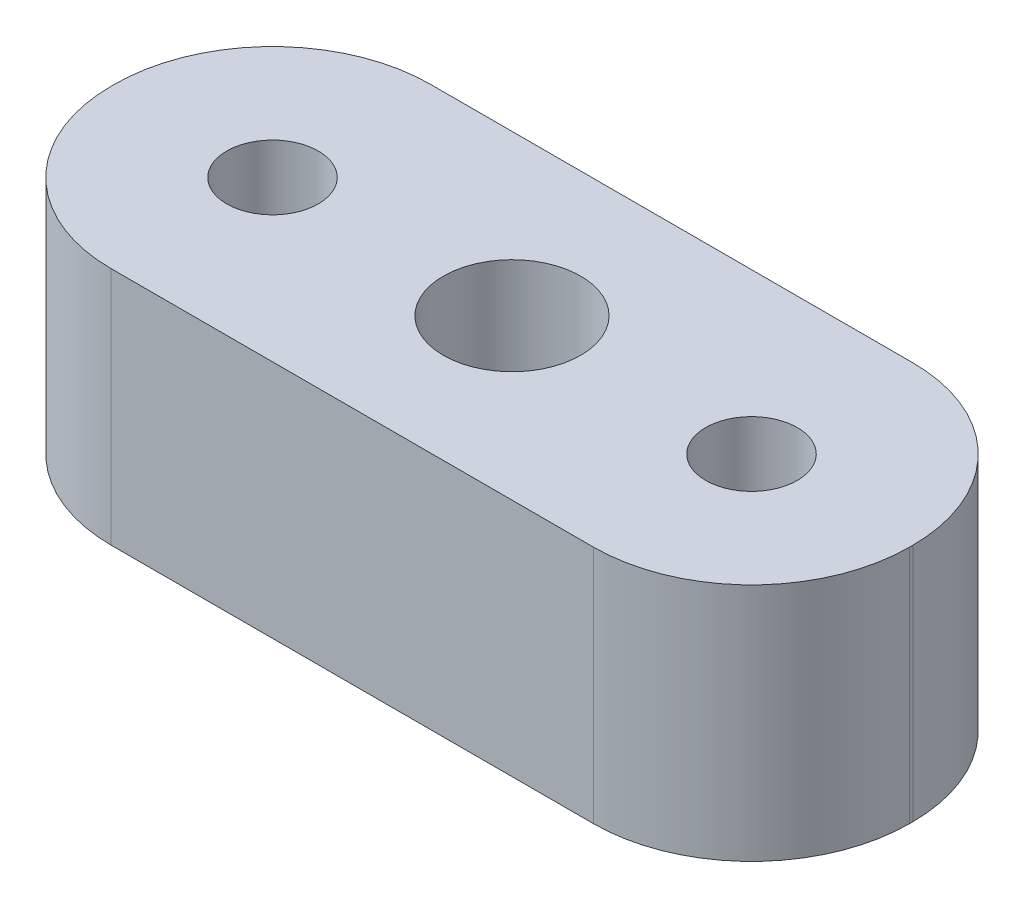
ISO-10303-21;
HEADER;
FILE_DESCRIPTION(('STEP AP214'),'2;1');
FILE_NAME('part.step','',(''),(''),'','','');
FILE_SCHEMA(('AUTOMOTIVE_DESIGN { 1 0 10303 214 1 1 1 1 }'));
ENDSEC;
DATA;
#1=APPLICATION_CONTEXT('core data for automotive mechanical design processes');
#2=APPLICATION_PROTOCOL_DEFINITION('international standard','automotive_design',2000,#1);
#3=PRODUCT_CONTEXT('',#1,'mechanical');
#4=PRODUCT('Part','Part','',(#3));
#5=PRODUCT_RELATED_PRODUCT_CATEGORY('part','',(#4));
#6=PRODUCT_DEFINITION_FORMATION('','',#4);
#7=PRODUCT_DEFINITION_CONTEXT('part definition',#1,'design');
#8=PRODUCT_DEFINITION('design','',#6,#7);
#9=PRODUCT_DEFINITION_SHAPE('','',#8);
#10=(LENGTH_UNIT() NAMED_UNIT(*) SI_UNIT(.MILLI.,.METRE.));
#11=(NAMED_UNIT(*) PLANE_ANGLE_UNIT() SI_UNIT($,.RADIAN.));
#12=(NAMED_UNIT(*) SI_UNIT($,.STERADIAN.) SOLID_ANGLE_UNIT());
#13=UNCERTAINTY_MEASURE_WITH_UNIT(LENGTH_MEASURE(1.E-05),#10,'distance_accuracy_value','');
#14=(GEOMETRIC_REPRESENTATION_CONTEXT(3) GLOBAL_UNCERTAINTY_ASSIGNED_CONTEXT((#13)) GLOBAL_UNIT_ASSIGNED_CONTEXT((#10,
#11,#12)) REPRESENTATION_CONTEXT('',''));
#15=CARTESIAN_POINT('',(0.,0.,0.));
#16=DIRECTION('',(0.,0.,1.));
#17=DIRECTION('',(1.,0.,0.));
#18=AXIS2_PLACEMENT_3D('',#15,#16,#17);
#19=CARTESIAN_POINT('',(-1.51,1.5,-0.00999999999999959));
#20=DIRECTION('',(0.,-1.,0.));
#21=DIRECTION('',(0.,0.,-1.));
#22=AXIS2_PLACEMENT_3D('',#19,#20,#21);
#23=CYLINDRICAL_SURFACE('',#22,0.99);
#24=CARTESIAN_POINT('',(-1.51,0.,-0.00999999999999959));
#25=DIRECTION('',(0.,1.,0.));
#26=DIRECTION('',(0.,0.,1.));
#27=AXIS2_PLACEMENT_3D('',#24,#25,#26);
#28=CIRCLE('',#27,0.99);
#29=CARTESIAN_POINT('',(-2.5,0.,-0.00999999999999947));
#30=VERTEX_POINT('',#29);
#31=CARTESIAN_POINT('',(-1.51,0.,-1.));
#32=VERTEX_POINT('',#31);
#33=EDGE_CURVE('E140',#30,#32,#28,.F.);
#34=ORIENTED_EDGE('',*,*,#33,.F.);
#35=DIRECTION('',(0.,-1.,0.));
#36=VECTOR('',#35,1.);
#37=CARTESIAN_POINT('',(-2.5,1.5,-0.00999999999999947));
#38=LINE('',#37,#36);
#39=CARTESIAN_POINT('',(-2.5,1.5,-0.00999999999999947));
#40=VERTEX_POINT('',#39);
#41=EDGE_CURVE('E11',#40,#30,#38,.T.);
#42=ORIENTED_EDGE('',*,*,#41,.F.);
#43=CARTESIAN_POINT('',(-1.51,1.5,-0.00999999999999959));
#44=DIRECTION('',(0.,1.,0.));
#45=DIRECTION('',(0.,0.,1.));
#46=AXIS2_PLACEMENT_3D('',#43,#44,#45);
#47=CIRCLE('',#46,0.99);
#48=CARTESIAN_POINT('',(-1.51,1.5,-1.));
#49=VERTEX_POINT('',#48);
#50=EDGE_CURVE('E168',#40,#49,#47,.F.);
#51=ORIENTED_EDGE('',*,*,#50,.T.);
#52=DIRECTION('',(0.,-1.,0.));
#53=VECTOR('',#52,1.);
#54=CARTESIAN_POINT('',(-1.51,1.5,-1.));
#55=LINE('',#54,#53);
#56=EDGE_CURVE('E51',#49,#32,#55,.T.);
#57=ORIENTED_EDGE('',*,*,#56,.T.);
#58=EDGE_LOOP('',(#34,#42,#51,#57));
#59=FACE_BOUND('',#58,.T.);
#60=ADVANCED_FACE('F35',(#59),#23,.T.);
#61=CARTESIAN_POINT('',(-2.5,1.5,0.));
#62=DIRECTION('',(1.,0.,0.));
#63=DIRECTION('',(0.,0.,-1.));
#64=AXIS2_PLACEMENT_3D('',#61,#62,#63);
#65=PLANE('',#64);
#66=DIRECTION('',(0.,0.,1.));
#67=VECTOR('',#66,1.);
#68=CARTESIAN_POINT('',(-2.5,0.,0.));
#69=LINE('',#68,#67);
#70=CARTESIAN_POINT('',(-2.5,0.,0.0100000000000003));
#71=VERTEX_POINT('',#70);
#72=EDGE_CURVE('E142',#30,#71,#69,.T.);
#73=ORIENTED_EDGE('',*,*,#72,.T.);
#74=DIRECTION('',(0.,-1.,0.));
#75=VECTOR('',#74,1.);
#76=CARTESIAN_POINT('',(-2.5,1.5,0.0100000000000003));
#77=LINE('',#76,#75);
#78=CARTESIAN_POINT('',(-2.5,1.5,0.0100000000000003));
#79=VERTEX_POINT('',#78);
#80=EDGE_CURVE('E43',#79,#71,#77,.T.);
#81=ORIENTED_EDGE('',*,*,#80,.F.);
#82=DIRECTION('',(0.,0.,1.));
#83=VECTOR('',#82,1.);
#84=CARTESIAN_POINT('',(-2.5,1.5,0.));
#85=LINE('',#84,#83);
#86=EDGE_CURVE('E319',#40,#79,#85,.T.);
#87=ORIENTED_EDGE('',*,*,#86,.F.);
#88=ORIENTED_EDGE('',*,*,#41,.T.);
#89=EDGE_LOOP('',(#73,#81,#87,#88));
#90=FACE_BOUND('',#89,.T.);
#91=ADVANCED_FACE('F185',(#90),#65,.F.);
#92=CARTESIAN_POINT('',(-1.51,1.5,0.0100000000000002));
#93=DIRECTION('',(0.,-1.,0.));
#94=DIRECTION('',(0.,0.,-1.));
#95=AXIS2_PLACEMENT_3D('',#92,#93,#94);
#96=CYLINDRICAL_SURFACE('',#95,0.99);
#97=CARTESIAN_POINT('',(-1.51,0.,0.0100000000000002));
#98=DIRECTION('',(0.,1.,0.));
#99=DIRECTION('',(0.,0.,1.));
#100=AXIS2_PLACEMENT_3D('',#97,#98,#99);
#101=CIRCLE('',#100,0.99);
#102=CARTESIAN_POINT('',(-1.51,0.,1.));
#103=VERTEX_POINT('',#102);
#104=EDGE_CURVE('E145',#103,#71,#101,.F.);
#105=ORIENTED_EDGE('',*,*,#104,.F.);
#106=DIRECTION('',(0.,-1.,0.));
#107=VECTOR('',#106,1.);
#108=CARTESIAN_POINT('',(-1.51,1.5,1.));
#109=LINE('',#108,#107);
#110=CARTESIAN_POINT('',(-1.51,1.5,1.));
#111=VERTEX_POINT('',#110);
#112=EDGE_CURVE('E175',#111,#103,#109,.T.);
#113=ORIENTED_EDGE('',*,*,#112,.F.);
#114=CARTESIAN_POINT('',(-1.51,1.5,0.0100000000000002));
#115=DIRECTION('',(0.,1.,0.));
#116=DIRECTION('',(0.,0.,1.));
#117=AXIS2_PLACEMENT_3D('',#114,#115,#116);
#118=CIRCLE('',#117,0.99);
#119=EDGE_CURVE('E182',#111,#79,#118,.F.);
#120=ORIENTED_EDGE('',*,*,#119,.T.);
#121=ORIENTED_EDGE('',*,*,#80,.T.);
#122=EDGE_LOOP('',(#105,#113,#120,#121));
#123=FACE_BOUND('',#122,.T.);
#124=ADVANCED_FACE('F180',(#123),#96,.T.);
#125=CARTESIAN_POINT('',(0.,1.5,1.));
#126=DIRECTION('',(0.,0.,-1.));
#127=DIRECTION('',(-1.,0.,0.));
#128=AXIS2_PLACEMENT_3D('',#125,#126,#127);
#129=PLANE('',#128);
#130=DIRECTION('',(1.,0.,0.));
#131=VECTOR('',#130,1.);
#132=CARTESIAN_POINT('',(0.,0.,1.));
#133=LINE('',#132,#131);
#134=CARTESIAN_POINT('',(1.50999999999999,0.,1.));
#135=VERTEX_POINT('',#134);
#136=EDGE_CURVE('E148',#103,#135,#133,.T.);
#137=ORIENTED_EDGE('',*,*,#136,.T.);
#138=DIRECTION('',(0.,-1.,0.));
#139=VECTOR('',#138,1.);
#140=CARTESIAN_POINT('',(1.50999999999999,1.5,1.));
#141=LINE('',#140,#139);
#142=CARTESIAN_POINT('',(1.50999999999999,1.5,1.));
#143=VERTEX_POINT('',#142);
#144=EDGE_CURVE('E172',#143,#135,#141,.T.);
#145=ORIENTED_EDGE('',*,*,#144,.F.);
#146=DIRECTION('',(1.,0.,0.));
#147=VECTOR('',#146,1.);
#148=CARTESIAN_POINT('',(0.,1.5,1.));
#149=LINE('',#148,#147);
#150=EDGE_CURVE('E126',#111,#143,#149,.T.);
#151=ORIENTED_EDGE('',*,*,#150,.F.);
#152=ORIENTED_EDGE('',*,*,#112,.T.);
#153=EDGE_LOOP('',(#137,#145,#151,#152));
#154=FACE_BOUND('',#153,.T.);
#155=ADVANCED_FACE('F193',(#154),#129,.F.);
#156=CARTESIAN_POINT('',(1.51,1.5,0.00999999999999981));
#157=DIRECTION('',(0.,-1.,0.));
#158=DIRECTION('',(0.,0.,-1.));
#159=AXIS2_PLACEMENT_3D('',#156,#157,#158);
#160=CYLINDRICAL_SURFACE('',#159,0.99);
#161=CARTESIAN_POINT('',(1.51,0.,0.00999999999999981));
#162=DIRECTION('',(0.,1.,0.));
#163=DIRECTION('',(0.,0.,1.));
#164=AXIS2_PLACEMENT_3D('',#161,#162,#163);
#165=CIRCLE('',#164,0.99);
#166=CARTESIAN_POINT('',(2.5,0.,0.00999999999999309));
#167=VERTEX_POINT('',#166);
#168=EDGE_CURVE('E150',#135,#167,#165,.T.);
#169=ORIENTED_EDGE('',*,*,#168,.T.);
#170=DIRECTION('',(0.,-1.,0.));
#171=VECTOR('',#170,1.);
#172=CARTESIAN_POINT('',(2.5,1.5,0.00999999999999309));
#173=LINE('',#172,#171);
#174=CARTESIAN_POINT('',(2.5,1.5,0.00999999999999309));
#175=VERTEX_POINT('',#174);
#176=EDGE_CURVE('E111',#175,#167,#173,.T.);
#177=ORIENTED_EDGE('',*,*,#176,.F.);
#178=CARTESIAN_POINT('',(1.51,1.5,0.00999999999999981));
#179=DIRECTION('',(0.,1.,0.));
#180=DIRECTION('',(0.,0.,1.));
#181=AXIS2_PLACEMENT_3D('',#178,#179,#180);
#182=CIRCLE('',#181,0.99);
#183=EDGE_CURVE('E123',#143,#175,#182,.T.);
#184=ORIENTED_EDGE('',*,*,#183,.F.);
#185=ORIENTED_EDGE('',*,*,#144,.T.);
#186=EDGE_LOOP('',(#169,#177,#184,#185));
#187=FACE_BOUND('',#186,.T.);
#188=ADVANCED_FACE('F196',(#187),#160,.T.);
#189=CARTESIAN_POINT('',(2.5,1.5,0.));
#190=DIRECTION('',(1.,0.,0.));
#191=DIRECTION('',(0.,0.,-1.));
#192=AXIS2_PLACEMENT_3D('',#189,#190,#191);
#193=PLANE('',#192);
#194=DIRECTION('',(0.,0.,1.));
#195=VECTOR('',#194,1.);
#196=CARTESIAN_POINT('',(2.5,0.,0.));
#197=LINE('',#196,#195);
#198=CARTESIAN_POINT('',(2.5,0.,-0.00999999999999309));
#199=VERTEX_POINT('',#198);
#200=EDGE_CURVE('E108',#199,#167,#197,.T.);
#201=ORIENTED_EDGE('',*,*,#200,.F.);
#202=DIRECTION('',(0.,-1.,0.));
#203=VECTOR('',#202,1.);
#204=CARTESIAN_POINT('',(2.5,1.5,-0.00999999999999309));
#205=LINE('',#204,#203);
#206=CARTESIAN_POINT('',(2.5,1.5,-0.00999999999999309));
#207=VERTEX_POINT('',#206);
#208=EDGE_CURVE('E102',#207,#199,#205,.T.);
#209=ORIENTED_EDGE('',*,*,#208,.F.);
#210=DIRECTION('',(0.,0.,1.));
#211=VECTOR('',#210,1.);
#212=CARTESIAN_POINT('',(2.5,1.5,0.));
#213=LINE('',#212,#211);
#214=EDGE_CURVE('E106',#207,#175,#213,.T.);
#215=ORIENTED_EDGE('',*,*,#214,.T.);
#216=ORIENTED_EDGE('',*,*,#176,.T.);
#217=EDGE_LOOP('',(#201,#209,#215,#216));
#218=FACE_BOUND('',#217,.T.);
#219=ADVANCED_FACE('F104',(#218),#193,.T.);
#220=CARTESIAN_POINT('',(1.51,1.5,-0.0100000000000002));
#221=DIRECTION('',(0.,-1.,0.));
#222=DIRECTION('',(0.,0.,-1.));
#223=AXIS2_PLACEMENT_3D('',#220,#221,#222);
#224=CYLINDRICAL_SURFACE('',#223,0.99);
#225=CARTESIAN_POINT('',(1.51,0.,-0.0100000000000002));
#226=DIRECTION('',(0.,1.,0.));
#227=DIRECTION('',(0.,0.,1.));
#228=AXIS2_PLACEMENT_3D('',#225,#226,#227);
#229=CIRCLE('',#228,0.99);
#230=CARTESIAN_POINT('',(1.50999999999999,0.,-1.));
#231=VERTEX_POINT('',#230);
#232=EDGE_CURVE('E154',#199,#231,#229,.T.);
#233=ORIENTED_EDGE('',*,*,#232,.T.);
#234=DIRECTION('',(0.,-1.,0.));
#235=VECTOR('',#234,1.);
#236=CARTESIAN_POINT('',(1.50999999999999,1.5,-1.));
#237=LINE('',#236,#235);
#238=CARTESIAN_POINT('',(1.50999999999999,1.5,-1.));
#239=VERTEX_POINT('',#238);
#240=EDGE_CURVE('E77',#239,#231,#237,.T.);
#241=ORIENTED_EDGE('',*,*,#240,.F.);
#242=CARTESIAN_POINT('',(1.51,1.5,-0.0100000000000002));
#243=DIRECTION('',(0.,1.,0.));
#244=DIRECTION('',(0.,0.,1.));
#245=AXIS2_PLACEMENT_3D('',#242,#243,#244);
#246=CIRCLE('',#245,0.99);
#247=EDGE_CURVE('E113',#207,#239,#246,.T.);
#248=ORIENTED_EDGE('',*,*,#247,.F.);
#249=ORIENTED_EDGE('',*,*,#208,.T.);
#250=EDGE_LOOP('',(#233,#241,#248,#249));
#251=FACE_BOUND('',#250,.T.);
#252=ADVANCED_FACE('F114',(#251),#224,.T.);
#253=CARTESIAN_POINT('',(1.5,1.5,0.));
#254=DIRECTION('',(0.,-1.,0.));
#255=DIRECTION('',(0.,0.,-1.));
#256=AXIS2_PLACEMENT_3D('',#253,#254,#255);
#257=CYLINDRICAL_SURFACE('',#256,0.287);
#258=CARTESIAN_POINT('',(1.5,1.5,0.));
#259=DIRECTION('',(0.,1.,0.));
#260=DIRECTION('',(0.,0.,1.));
#261=AXIS2_PLACEMENT_3D('',#258,#259,#260);
#262=CIRCLE('',#261,0.287);
#263=CARTESIAN_POINT('',(1.5,1.5,0.287));
#264=VERTEX_POINT('',#263);
#265=EDGE_CURVE('E134',#264,#264,#262,.T.);
#266=ORIENTED_EDGE('',*,*,#265,.T.);
#267=EDGE_LOOP('',(#266));
#268=FACE_BOUND('',#267,.T.);
#269=CARTESIAN_POINT('',(1.5,0.,0.));
#270=DIRECTION('',(0.,1.,0.));
#271=DIRECTION('',(0.,0.,1.));
#272=AXIS2_PLACEMENT_3D('',#269,#270,#271);
#273=CIRCLE('',#272,0.287);
#274=CARTESIAN_POINT('',(1.5,0.,0.287));
#275=VERTEX_POINT('',#274);
#276=EDGE_CURVE('E162',#275,#275,#273,.T.);
#277=ORIENTED_EDGE('',*,*,#276,.F.);
#278=EDGE_LOOP('',(#277));
#279=FACE_BOUND('',#278,.T.);
#280=ADVANCED_FACE('F208',(#268,#279),#257,.F.);
#281=CARTESIAN_POINT('',(-1.5,1.5,0.));
#282=DIRECTION('',(0.,-1.,0.));
#283=DIRECTION('',(0.,0.,-1.));
#284=AXIS2_PLACEMENT_3D('',#281,#282,#283);
#285=CYLINDRICAL_SURFACE('',#284,0.287);
#286=CARTESIAN_POINT('',(-1.5,1.5,0.));
#287=DIRECTION('',(0.,1.,0.));
#288=DIRECTION('',(0.,0.,1.));
#289=AXIS2_PLACEMENT_3D('',#286,#287,#288);
#290=CIRCLE('',#289,0.287);
#291=CARTESIAN_POINT('',(-1.5,1.5,0.287));
#292=VERTEX_POINT('',#291);
#293=EDGE_CURVE('E131',#292,#292,#290,.T.);
#294=ORIENTED_EDGE('',*,*,#293,.T.);
#295=EDGE_LOOP('',(#294));
#296=FACE_BOUND('',#295,.T.);
#297=CARTESIAN_POINT('',(-1.5,0.,0.));
#298=DIRECTION('',(0.,1.,0.));
#299=DIRECTION('',(0.,0.,1.));
#300=AXIS2_PLACEMENT_3D('',#297,#298,#299);
#301=CIRCLE('',#300,0.287);
#302=CARTESIAN_POINT('',(-1.5,0.,0.287));
#303=VERTEX_POINT('',#302);
#304=EDGE_CURVE('E159',#303,#303,#301,.T.);
#305=ORIENTED_EDGE('',*,*,#304,.F.);
#306=EDGE_LOOP('',(#305));
#307=FACE_BOUND('',#306,.T.);
#308=ADVANCED_FACE('F200',(#296,#307),#285,.F.);
#309=CARTESIAN_POINT('',(0.,1.5,-1.));
#310=DIRECTION('',(0.,0.,-1.));
#311=DIRECTION('',(-1.,0.,0.));
#312=AXIS2_PLACEMENT_3D('',#309,#310,#311);
#313=PLANE('',#312);
#314=DIRECTION('',(1.,0.,0.));
#315=VECTOR('',#314,1.);
#316=CARTESIAN_POINT('',(0.,0.,-1.));
#317=LINE('',#316,#315);
#318=EDGE_CURVE('E156',#32,#231,#317,.T.);
#319=ORIENTED_EDGE('',*,*,#318,.F.);
#320=ORIENTED_EDGE('',*,*,#56,.F.);
#321=DIRECTION('',(1.,0.,0.));
#322=VECTOR('',#321,1.);
#323=CARTESIAN_POINT('',(0.,1.5,-1.));
#324=LINE('',#323,#322);
#325=EDGE_CURVE('E117',#49,#239,#324,.T.);
#326=ORIENTED_EDGE('',*,*,#325,.T.);
#327=ORIENTED_EDGE('',*,*,#240,.T.);
#328=EDGE_LOOP('',(#319,#320,#326,#327));
#329=FACE_BOUND('',#328,.T.);
#330=ADVANCED_FACE('F197',(#329),#313,.T.);
#331=CARTESIAN_POINT('',(0.,1.5,0.));
#332=DIRECTION('',(0.,-1.,0.));
#333=DIRECTION('',(0.,0.,-1.));
#334=AXIS2_PLACEMENT_3D('',#331,#332,#333);
#335=CYLINDRICAL_SURFACE('',#334,0.43);
#336=CARTESIAN_POINT('',(0.,1.5,0.));
#337=DIRECTION('',(0.,1.,0.));
#338=DIRECTION('',(0.,0.,1.));
#339=AXIS2_PLACEMENT_3D('',#336,#337,#338);
#340=CIRCLE('',#339,0.43);
#341=CARTESIAN_POINT('',(0.,1.5,0.43));
#342=VERTEX_POINT('',#341);
#343=EDGE_CURVE('E137',#342,#342,#340,.T.);
#344=ORIENTED_EDGE('',*,*,#343,.T.);
#345=EDGE_LOOP('',(#344));
#346=FACE_BOUND('',#345,.T.);
#347=CARTESIAN_POINT('',(0.,0.,0.));
#348=DIRECTION('',(0.,1.,0.));
#349=DIRECTION('',(0.,0.,1.));
#350=AXIS2_PLACEMENT_3D('',#347,#348,#349);
#351=CIRCLE('',#350,0.43);
#352=CARTESIAN_POINT('',(0.,0.,0.43));
#353=VERTEX_POINT('',#352);
#354=EDGE_CURVE('E165',#353,#353,#351,.T.);
#355=ORIENTED_EDGE('',*,*,#354,.F.);
#356=EDGE_LOOP('',(#355));
#357=FACE_BOUND('',#356,.T.);
#358=ADVANCED_FACE('F199',(#346,#357),#335,.F.);
#359=CARTESIAN_POINT('',(0.,1.5,0.));
#360=DIRECTION('',(0.,1.,0.));
#361=DIRECTION('',(0.,0.,1.));
#362=AXIS2_PLACEMENT_3D('',#359,#360,#361);
#363=PLANE('',#362);
#364=ORIENTED_EDGE('',*,*,#50,.F.);
#365=ORIENTED_EDGE('',*,*,#86,.T.);
#366=ORIENTED_EDGE('',*,*,#119,.F.);
#367=ORIENTED_EDGE('',*,*,#150,.T.);
#368=ORIENTED_EDGE('',*,*,#183,.T.);
#369=ORIENTED_EDGE('',*,*,#214,.F.);
#370=ORIENTED_EDGE('',*,*,#247,.T.);
#371=ORIENTED_EDGE('',*,*,#325,.F.);
#372=EDGE_LOOP('',(#364,#365,#366,#367,#368,#369,#370,#371));
#373=FACE_BOUND('',#372,.T.);
#374=ORIENTED_EDGE('',*,*,#293,.F.);
#375=EDGE_LOOP('',(#374));
#376=FACE_BOUND('',#375,.T.);
#377=ORIENTED_EDGE('',*,*,#265,.F.);
#378=EDGE_LOOP('',(#377));
#379=FACE_BOUND('',#378,.T.);
#380=ORIENTED_EDGE('',*,*,#343,.F.);
#381=EDGE_LOOP('',(#380));
#382=FACE_BOUND('',#381,.T.);
#383=ADVANCED_FACE('F120',(#373,#376,#379,#382),#363,.T.);
#384=CARTESIAN_POINT('',(0.,0.,0.));
#385=DIRECTION('',(0.,1.,0.));
#386=DIRECTION('',(0.,0.,1.));
#387=AXIS2_PLACEMENT_3D('',#384,#385,#386);
#388=PLANE('',#387);
#389=ORIENTED_EDGE('',*,*,#33,.T.);
#390=ORIENTED_EDGE('',*,*,#318,.T.);
#391=ORIENTED_EDGE('',*,*,#232,.F.);
#392=ORIENTED_EDGE('',*,*,#200,.T.);
#393=ORIENTED_EDGE('',*,*,#168,.F.);
#394=ORIENTED_EDGE('',*,*,#136,.F.);
#395=ORIENTED_EDGE('',*,*,#104,.T.);
#396=ORIENTED_EDGE('',*,*,#72,.F.);
#397=EDGE_LOOP('',(#389,#390,#391,#392,#393,#394,#395,#396));
#398=FACE_BOUND('',#397,.T.);
#399=ORIENTED_EDGE('',*,*,#304,.T.);
#400=EDGE_LOOP('',(#399));
#401=FACE_BOUND('',#400,.T.);
#402=ORIENTED_EDGE('',*,*,#276,.T.);
#403=EDGE_LOOP('',(#402));
#404=FACE_BOUND('',#403,.T.);
#405=ORIENTED_EDGE('',*,*,#354,.T.);
#406=EDGE_LOOP('',(#405));
#407=FACE_BOUND('',#406,.T.);
#408=ADVANCED_FACE('F188',(#398,#401,#404,#407),#388,.F.);
#409=CLOSED_SHELL('',(#60,#91,#124,#155,#188,#219,#252,#280,#308,#330,#358,#383,#408));
#410=MANIFOLD_SOLID_BREP('B2',#409);
#411=ADVANCED_BREP_SHAPE_REPRESENTATION('',(#18,#410),#14);
#412=SHAPE_DEFINITION_REPRESENTATION(#9,#411);
ENDSEC;
END-ISO-10303-21;
